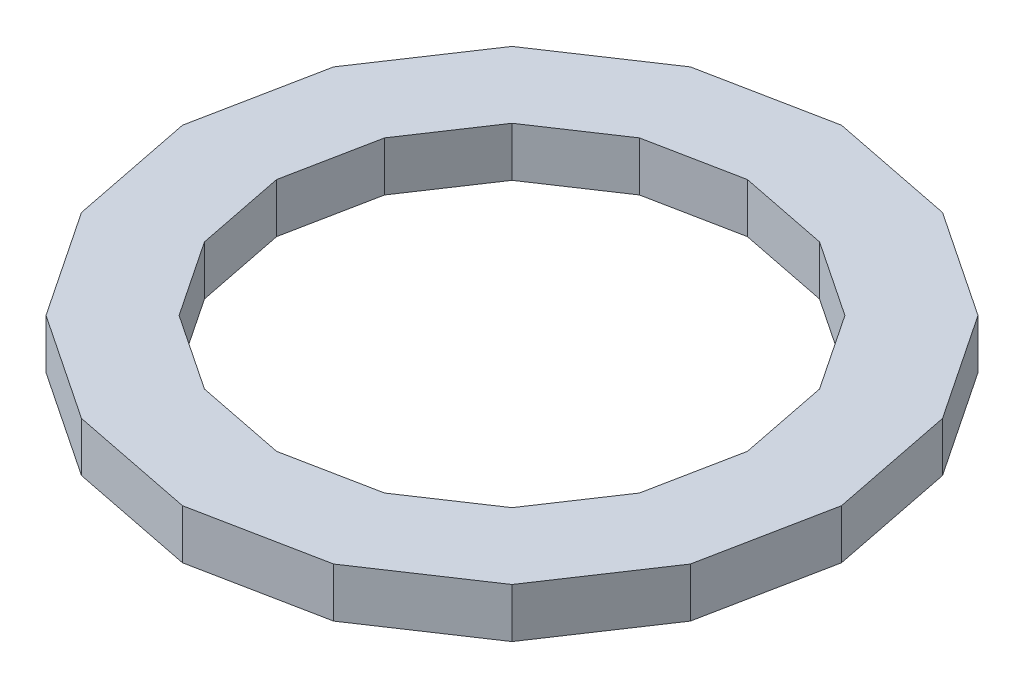
ISO-10303-21;
HEADER;
FILE_DESCRIPTION(('STEP AP214'),'2;1');
FILE_NAME('part.step','',(''),(''),'','','');
FILE_SCHEMA(('AUTOMOTIVE_DESIGN { 1 0 10303 214 1 1 1 1 }'));
ENDSEC;
DATA;
#1=APPLICATION_CONTEXT('core data for automotive mechanical design processes');
#2=APPLICATION_PROTOCOL_DEFINITION('international standard','automotive_design',2000,#1);
#3=PRODUCT_CONTEXT('',#1,'mechanical');
#4=PRODUCT('Part','Part','',(#3));
#5=PRODUCT_RELATED_PRODUCT_CATEGORY('part','',(#4));
#6=PRODUCT_DEFINITION_FORMATION('','',#4);
#7=PRODUCT_DEFINITION_CONTEXT('part definition',#1,'design');
#8=PRODUCT_DEFINITION('design','',#6,#7);
#9=PRODUCT_DEFINITION_SHAPE('','',#8);
#10=(LENGTH_UNIT() NAMED_UNIT(*) SI_UNIT(.MILLI.,.METRE.));
#11=(NAMED_UNIT(*) PLANE_ANGLE_UNIT() SI_UNIT($,.RADIAN.));
#12=(NAMED_UNIT(*) SI_UNIT($,.STERADIAN.) SOLID_ANGLE_UNIT());
#13=UNCERTAINTY_MEASURE_WITH_UNIT(LENGTH_MEASURE(1.E-05),#10,'distance_accuracy_value','');
#14=(GEOMETRIC_REPRESENTATION_CONTEXT(3) GLOBAL_UNCERTAINTY_ASSIGNED_CONTEXT((#13)) GLOBAL_UNIT_ASSIGNED_CONTEXT((#10,
#11,#12)) REPRESENTATION_CONTEXT('',''));
#15=CARTESIAN_POINT('',(0.,0.,0.));
#16=DIRECTION('',(0.,0.,1.));
#17=DIRECTION('',(1.,0.,0.));
#18=AXIS2_PLACEMENT_3D('',#15,#16,#17);
#19=CARTESIAN_POINT('',(0.,19.05,0.));
#20=DIRECTION('',(0.,1.,0.));
#21=DIRECTION('',(0.,0.,1.));
#22=AXIS2_PLACEMENT_3D('',#19,#20,#21);
#23=PLANE('',#22);
#24=DIRECTION('',(0.195090322016117,0.,-0.980785280403233));
#25=VECTOR('',#24,1.);
#26=CARTESIAN_POINT('',(117.278378477179,19.05,48.5782949383707));
#27=LINE('',#26,#25);
#28=CARTESIAN_POINT('',(117.278378477179,19.05,48.5782949383707));
#29=VERTEX_POINT('',#28);
#30=CARTESIAN_POINT('',(126.941202126637,19.05,-1.53002353760145E-12));
#31=VERTEX_POINT('',#30);
#32=EDGE_CURVE('E371',#29,#31,#27,.T.);
#33=ORIENTED_EDGE('',*,*,#32,.T.);
#34=DIRECTION('',(-0.19509032201614,0.,-0.980785280403228));
#35=VECTOR('',#34,1.);
#36=CARTESIAN_POINT('',(126.941202126637,19.05,-1.53002353760145E-12));
#37=LINE('',#36,#35);
#38=CARTESIAN_POINT('',(117.278378477178,19.05,-48.5782949383734));
#39=VERTEX_POINT('',#38);
#40=EDGE_CURVE('E374',#31,#39,#37,.T.);
#41=ORIENTED_EDGE('',*,*,#40,.T.);
#42=DIRECTION('',(-0.555570233019612,0.,-0.831469612302539));
#43=VECTOR('',#42,1.);
#44=CARTESIAN_POINT('',(117.278378477178,19.05,-48.5782949383734));
#45=LINE('',#44,#43);
#46=CARTESIAN_POINT('',(89.7609848357161,19.05,-89.7609848357183));
#47=VERTEX_POINT('',#46);
#48=EDGE_CURVE('E377',#39,#47,#45,.T.);
#49=ORIENTED_EDGE('',*,*,#48,.T.);
#50=DIRECTION('',(-0.831469612302552,0.,-0.555570233019592));
#51=VECTOR('',#50,1.);
#52=CARTESIAN_POINT('',(89.7609848357161,19.05,-89.7609848357183));
#53=LINE('',#52,#51);
#54=CARTESIAN_POINT('',(48.5782949383707,19.05,-117.278378477179));
#55=VERTEX_POINT('',#54);
#56=EDGE_CURVE('E379',#47,#55,#53,.T.);
#57=ORIENTED_EDGE('',*,*,#56,.T.);
#58=DIRECTION('',(-0.980785280403233,0.,-0.195090322016116));
#59=VECTOR('',#58,1.);
#60=CARTESIAN_POINT('',(48.5782949383707,19.05,-117.278378477179));
#61=LINE('',#60,#59);
#62=CARTESIAN_POINT('',(-1.53262944923296E-12,19.05,-126.941202126637));
#63=VERTEX_POINT('',#62);
#64=EDGE_CURVE('E381',#55,#63,#61,.T.);
#65=ORIENTED_EDGE('',*,*,#64,.T.);
#66=DIRECTION('',(-0.980785280403228,0.,0.19509032201614));
#67=VECTOR('',#66,1.);
#68=CARTESIAN_POINT('',(-1.53262944923296E-12,19.05,-126.941202126637));
#69=LINE('',#68,#67);
#70=CARTESIAN_POINT('',(-48.5782949383734,19.05,-117.278378477178));
#71=VERTEX_POINT('',#70);
#72=EDGE_CURVE('E383',#63,#71,#69,.T.);
#73=ORIENTED_EDGE('',*,*,#72,.T.);
#74=DIRECTION('',(-0.831469612302539,0.,0.555570233019612));
#75=VECTOR('',#74,1.);
#76=CARTESIAN_POINT('',(-48.5782949383734,19.05,-117.278378477178));
#77=LINE('',#76,#75);
#78=CARTESIAN_POINT('',(-89.7609848357183,19.05,-89.7609848357161));
#79=VERTEX_POINT('',#78);
#80=EDGE_CURVE('E385',#71,#79,#77,.T.);
#81=ORIENTED_EDGE('',*,*,#80,.T.);
#82=DIRECTION('',(-0.555570233019592,0.,0.831469612302552));
#83=VECTOR('',#82,1.);
#84=CARTESIAN_POINT('',(-89.7609848357183,19.05,-89.7609848357161));
#85=LINE('',#84,#83);
#86=CARTESIAN_POINT('',(-117.278378477179,19.05,-48.5782949383707));
#87=VERTEX_POINT('',#86);
#88=EDGE_CURVE('E387',#79,#87,#85,.T.);
#89=ORIENTED_EDGE('',*,*,#88,.T.);
#90=DIRECTION('',(-0.195090322016117,0.,0.980785280403233));
#91=VECTOR('',#90,1.);
#92=CARTESIAN_POINT('',(-117.278378477179,19.05,-48.5782949383707));
#93=LINE('',#92,#91);
#94=CARTESIAN_POINT('',(-126.941202126637,19.05,1.5616333386167E-12));
#95=VERTEX_POINT('',#94);
#96=EDGE_CURVE('E390',#87,#95,#93,.T.);
#97=ORIENTED_EDGE('',*,*,#96,.T.);
#98=DIRECTION('',(0.19509032201614,0.,0.980785280403228));
#99=VECTOR('',#98,1.);
#100=CARTESIAN_POINT('',(-126.941202126637,19.05,1.5616333386167E-12));
#101=LINE('',#100,#99);
#102=CARTESIAN_POINT('',(-117.278378477178,19.05,48.5782949383734));
#103=VERTEX_POINT('',#102);
#104=EDGE_CURVE('E392',#95,#103,#101,.T.);
#105=ORIENTED_EDGE('',*,*,#104,.T.);
#106=DIRECTION('',(0.555570233019612,0.,0.831469612302539));
#107=VECTOR('',#106,1.);
#108=CARTESIAN_POINT('',(-117.278378477178,19.05,48.5782949383734));
#109=LINE('',#108,#107);
#110=CARTESIAN_POINT('',(-89.7609848357162,19.05,89.7609848357182));
#111=VERTEX_POINT('',#110);
#112=EDGE_CURVE('E394',#103,#111,#109,.T.);
#113=ORIENTED_EDGE('',*,*,#112,.T.);
#114=DIRECTION('',(0.831469612302552,0.,0.555570233019592));
#115=VECTOR('',#114,1.);
#116=CARTESIAN_POINT('',(-89.7609848357162,19.05,89.7609848357182));
#117=LINE('',#116,#115);
#118=CARTESIAN_POINT('',(-48.5782949383706,19.05,117.278378477179));
#119=VERTEX_POINT('',#118);
#120=EDGE_CURVE('E397',#111,#119,#117,.T.);
#121=ORIENTED_EDGE('',*,*,#120,.T.);
#122=DIRECTION('',(0.980785280403233,0.,0.195090322016117));
#123=VECTOR('',#122,1.);
#124=CARTESIAN_POINT('',(-48.5782949383706,19.05,117.278378477179));
#125=LINE('',#124,#123);
#126=CARTESIAN_POINT('',(1.54465007218628E-12,19.05,126.941202126637));
#127=VERTEX_POINT('',#126);
#128=EDGE_CURVE('E400',#119,#127,#125,.T.);
#129=ORIENTED_EDGE('',*,*,#128,.T.);
#130=DIRECTION('',(0.980785280403228,0.,-0.195090322016139));
#131=VECTOR('',#130,1.);
#132=CARTESIAN_POINT('',(1.54465007218628E-12,19.05,126.941202126637));
#133=LINE('',#132,#131);
#134=CARTESIAN_POINT('',(48.5782949383735,19.05,117.278378477178));
#135=VERTEX_POINT('',#134);
#136=EDGE_CURVE('E402',#127,#135,#133,.T.);
#137=ORIENTED_EDGE('',*,*,#136,.T.);
#138=DIRECTION('',(0.831469612302538,0.,-0.555570233019612));
#139=VECTOR('',#138,1.);
#140=CARTESIAN_POINT('',(48.5782949383735,19.05,117.278378477178));
#141=LINE('',#140,#139);
#142=CARTESIAN_POINT('',(89.7609848357183,19.05,89.7609848357162));
#143=VERTEX_POINT('',#142);
#144=EDGE_CURVE('E405',#135,#143,#141,.T.);
#145=ORIENTED_EDGE('',*,*,#144,.T.);
#146=DIRECTION('',(0.555570233019592,0.,-0.831469612302552));
#147=VECTOR('',#146,1.);
#148=CARTESIAN_POINT('',(89.7609848357183,19.05,89.7609848357162));
#149=LINE('',#148,#147);
#150=EDGE_CURVE('E408',#143,#29,#149,.T.);
#151=ORIENTED_EDGE('',*,*,#150,.T.);
#152=EDGE_LOOP('',(#33,#41,#49,#57,#65,#73,#81,#89,#97,#105,#113,#121,#129,#137,#145,#151));
#153=FACE_BOUND('',#152,.T.);
#154=DIRECTION('',(-0.19509032201614,0.,-0.980785280403228));
#155=VECTOR('',#154,1.);
#156=CARTESIAN_POINT('',(90.6845405407492,19.05,-1.12429729305885E-12));
#157=LINE('',#156,#155);
#158=CARTESIAN_POINT('',(90.6845405407492,19.05,-1.12429729305885E-12));
#159=VERTEX_POINT('',#158);
#160=CARTESIAN_POINT('',(83.7815909207878,19.05,-34.703471236586));
#161=VERTEX_POINT('',#160);
#162=EDGE_CURVE('E253',#159,#161,#157,.T.);
#163=ORIENTED_EDGE('',*,*,#162,.F.);
#164=DIRECTION('',(0.195090322016117,0.,-0.980785280403233));
#165=VECTOR('',#164,1.);
#166=CARTESIAN_POINT('',(83.7815909207886,19.05,34.703471236584));
#167=LINE('',#166,#165);
#168=CARTESIAN_POINT('',(83.7815909207886,19.05,34.703471236584));
#169=VERTEX_POINT('',#168);
#170=EDGE_CURVE('E244',#169,#159,#167,.T.);
#171=ORIENTED_EDGE('',*,*,#170,.F.);
#172=DIRECTION('',(0.555570233019592,0.,-0.831469612302552));
#173=VECTOR('',#172,1.);
#174=CARTESIAN_POINT('',(64.1236535651509,19.05,64.1236535651494));
#175=LINE('',#174,#173);
#176=CARTESIAN_POINT('',(64.1236535651509,19.05,64.1236535651494));
#177=VERTEX_POINT('',#176);
#178=EDGE_CURVE('E296',#177,#169,#175,.T.);
#179=ORIENTED_EDGE('',*,*,#178,.F.);
#180=DIRECTION('',(0.831469612302539,0.,-0.555570233019612));
#181=VECTOR('',#180,1.);
#182=CARTESIAN_POINT('',(34.703471236586,19.05,83.7815909207878));
#183=LINE('',#182,#181);
#184=CARTESIAN_POINT('',(34.703471236586,19.05,83.7815909207878));
#185=VERTEX_POINT('',#184);
#186=EDGE_CURVE('E294',#185,#177,#183,.T.);
#187=ORIENTED_EDGE('',*,*,#186,.F.);
#188=DIRECTION('',(0.980785280403228,0.,-0.19509032201614));
#189=VECTOR('',#188,1.);
#190=CARTESIAN_POINT('',(1.02073300215481E-12,19.05,90.6845405407492));
#191=LINE('',#190,#189);
#192=CARTESIAN_POINT('',(1.02073300215481E-12,19.05,90.6845405407492));
#193=VERTEX_POINT('',#192);
#194=EDGE_CURVE('E292',#193,#185,#191,.T.);
#195=ORIENTED_EDGE('',*,*,#194,.F.);
#196=DIRECTION('',(0.980785280403233,0.,0.195090322016117));
#197=VECTOR('',#196,1.);
#198=CARTESIAN_POINT('',(-34.703471236584,19.05,83.7815909207887));
#199=LINE('',#198,#197);
#200=CARTESIAN_POINT('',(-34.703471236584,19.05,83.7815909207887));
#201=VERTEX_POINT('',#200);
#202=EDGE_CURVE('E290',#201,#193,#199,.T.);
#203=ORIENTED_EDGE('',*,*,#202,.F.);
#204=DIRECTION('',(0.831469612302552,0.,0.555570233019592));
#205=VECTOR('',#204,1.);
#206=CARTESIAN_POINT('',(-64.1236535651494,19.05,64.1236535651509));
#207=LINE('',#206,#205);
#208=CARTESIAN_POINT('',(-64.1236535651494,19.05,64.1236535651509));
#209=VERTEX_POINT('',#208);
#210=EDGE_CURVE('E288',#209,#201,#207,.T.);
#211=ORIENTED_EDGE('',*,*,#210,.F.);
#212=DIRECTION('',(0.555570233019612,0.,0.831469612302538));
#213=VECTOR('',#212,1.);
#214=CARTESIAN_POINT('',(-83.7815909207878,19.05,34.7034712365861));
#215=LINE('',#214,#213);
#216=CARTESIAN_POINT('',(-83.7815909207878,19.05,34.7034712365861));
#217=VERTEX_POINT('',#216);
#218=EDGE_CURVE('E286',#217,#209,#215,.T.);
#219=ORIENTED_EDGE('',*,*,#218,.F.);
#220=DIRECTION('',(0.19509032201614,0.,0.980785280403228));
#221=VECTOR('',#220,1.);
#222=CARTESIAN_POINT('',(-90.6845405407492,19.05,1.1506938046124E-12));
#223=LINE('',#222,#221);
#224=CARTESIAN_POINT('',(-90.6845405407492,19.05,1.1506938046124E-12));
#225=VERTEX_POINT('',#224);
#226=EDGE_CURVE('E284',#225,#217,#223,.T.);
#227=ORIENTED_EDGE('',*,*,#226,.F.);
#228=DIRECTION('',(-0.195090322016116,0.,0.980785280403233));
#229=VECTOR('',#228,1.);
#230=CARTESIAN_POINT('',(-83.7815909207886,19.05,-34.703471236584));
#231=LINE('',#230,#229);
#232=CARTESIAN_POINT('',(-83.7815909207886,19.05,-34.703471236584));
#233=VERTEX_POINT('',#232);
#234=EDGE_CURVE('E281',#233,#225,#231,.T.);
#235=ORIENTED_EDGE('',*,*,#234,.F.);
#236=DIRECTION('',(-0.555570233019592,0.,0.831469612302552));
#237=VECTOR('',#236,1.);
#238=CARTESIAN_POINT('',(-64.1236535651509,19.05,-64.1236535651493));
#239=LINE('',#238,#237);
#240=CARTESIAN_POINT('',(-64.1236535651509,19.05,-64.1236535651493));
#241=VERTEX_POINT('',#240);
#242=EDGE_CURVE('E278',#241,#233,#239,.T.);
#243=ORIENTED_EDGE('',*,*,#242,.F.);
#244=DIRECTION('',(-0.831469612302538,0.,0.555570233019612));
#245=VECTOR('',#244,1.);
#246=CARTESIAN_POINT('',(-34.7034712365861,19.05,-83.7815909207877));
#247=LINE('',#246,#245);
#248=CARTESIAN_POINT('',(-34.7034712365861,19.05,-83.7815909207877));
#249=VERTEX_POINT('',#248);
#250=EDGE_CURVE('E276',#249,#241,#247,.T.);
#251=ORIENTED_EDGE('',*,*,#250,.F.);
#252=DIRECTION('',(-0.980785280403228,0.,0.19509032201614));
#253=VECTOR('',#252,1.);
#254=CARTESIAN_POINT('',(-1.13817047648465E-12,19.05,-90.6845405407492));
#255=LINE('',#254,#253);
#256=CARTESIAN_POINT('',(-1.13817047648465E-12,19.05,-90.6845405407492));
#257=VERTEX_POINT('',#256);
#258=EDGE_CURVE('E274',#257,#249,#255,.T.);
#259=ORIENTED_EDGE('',*,*,#258,.F.);
#260=DIRECTION('',(-0.980785280403233,0.,-0.195090322016117));
#261=VECTOR('',#260,1.);
#262=CARTESIAN_POINT('',(34.7034712365841,19.05,-83.7815909207885));
#263=LINE('',#262,#261);
#264=CARTESIAN_POINT('',(34.7034712365841,19.05,-83.7815909207885));
#265=VERTEX_POINT('',#264);
#266=EDGE_CURVE('E272',#265,#257,#263,.T.);
#267=ORIENTED_EDGE('',*,*,#266,.F.);
#268=DIRECTION('',(-0.831469612302552,0.,-0.555570233019592));
#269=VECTOR('',#268,1.);
#270=CARTESIAN_POINT('',(64.1236535651494,19.05,-64.1236535651509));
#271=LINE('',#270,#269);
#272=CARTESIAN_POINT('',(64.1236535651494,19.05,-64.1236535651509));
#273=VERTEX_POINT('',#272);
#274=EDGE_CURVE('E268',#273,#265,#271,.T.);
#275=ORIENTED_EDGE('',*,*,#274,.F.);
#276=DIRECTION('',(-0.555570233019612,0.,-0.831469612302538));
#277=VECTOR('',#276,1.);
#278=CARTESIAN_POINT('',(83.7815909207878,19.05,-34.703471236586));
#279=LINE('',#278,#277);
#280=EDGE_CURVE('E266',#161,#273,#279,.T.);
#281=ORIENTED_EDGE('',*,*,#280,.F.);
#282=EDGE_LOOP('',(#163,#171,#179,#187,#195,#203,#211,#219,#227,#235,#243,#251,#259,#267,#275,#281));
#283=FACE_BOUND('',#282,.T.);
#284=ADVANCED_FACE('F35',(#153,#283),#23,.T.);
#285=CARTESIAN_POINT('',(0.,0.,0.));
#286=DIRECTION('',(0.,1.,0.));
#287=DIRECTION('',(0.,0.,1.));
#288=AXIS2_PLACEMENT_3D('',#285,#286,#287);
#289=PLANE('',#288);
#290=DIRECTION('',(0.195090322016117,0.,-0.980785280403233));
#291=VECTOR('',#290,1.);
#292=CARTESIAN_POINT('',(117.278378477179,0.,48.5782949383707));
#293=LINE('',#292,#291);
#294=CARTESIAN_POINT('',(117.278378477179,0.,48.5782949383707));
#295=VERTEX_POINT('',#294);
#296=CARTESIAN_POINT('',(126.941202126637,0.,-1.53002353760145E-12));
#297=VERTEX_POINT('',#296);
#298=EDGE_CURVE('E261',#295,#297,#293,.T.);
#299=ORIENTED_EDGE('',*,*,#298,.F.);
#300=DIRECTION('',(0.555570233019592,0.,-0.831469612302552));
#301=VECTOR('',#300,1.);
#302=CARTESIAN_POINT('',(89.7609848357183,0.,89.7609848357162));
#303=LINE('',#302,#301);
#304=CARTESIAN_POINT('',(89.7609848357183,0.,89.7609848357162));
#305=VERTEX_POINT('',#304);
#306=EDGE_CURVE('E375',#305,#295,#303,.T.);
#307=ORIENTED_EDGE('',*,*,#306,.F.);
#308=DIRECTION('',(0.831469612302538,0.,-0.555570233019612));
#309=VECTOR('',#308,1.);
#310=CARTESIAN_POINT('',(48.5782949383735,0.,117.278378477178));
#311=LINE('',#310,#309);
#312=CARTESIAN_POINT('',(48.5782949383735,0.,117.278378477178));
#313=VERTEX_POINT('',#312);
#314=EDGE_CURVE('E445',#313,#305,#311,.T.);
#315=ORIENTED_EDGE('',*,*,#314,.F.);
#316=DIRECTION('',(0.980785280403228,0.,-0.195090322016139));
#317=VECTOR('',#316,1.);
#318=CARTESIAN_POINT('',(1.54465007218628E-12,0.,126.941202126637));
#319=LINE('',#318,#317);
#320=CARTESIAN_POINT('',(1.54465007218628E-12,0.,126.941202126637));
#321=VERTEX_POINT('',#320);
#322=EDGE_CURVE('E442',#321,#313,#319,.T.);
#323=ORIENTED_EDGE('',*,*,#322,.F.);
#324=DIRECTION('',(0.980785280403233,0.,0.195090322016117));
#325=VECTOR('',#324,1.);
#326=CARTESIAN_POINT('',(-48.5782949383706,0.,117.278378477179));
#327=LINE('',#326,#325);
#328=CARTESIAN_POINT('',(-48.5782949383706,0.,117.278378477179));
#329=VERTEX_POINT('',#328);
#330=EDGE_CURVE('E439',#329,#321,#327,.T.);
#331=ORIENTED_EDGE('',*,*,#330,.F.);
#332=DIRECTION('',(0.831469612302552,0.,0.555570233019592));
#333=VECTOR('',#332,1.);
#334=CARTESIAN_POINT('',(-89.7609848357162,0.,89.7609848357182));
#335=LINE('',#334,#333);
#336=CARTESIAN_POINT('',(-89.7609848357162,0.,89.7609848357182));
#337=VERTEX_POINT('',#336);
#338=EDGE_CURVE('E436',#337,#329,#335,.T.);
#339=ORIENTED_EDGE('',*,*,#338,.F.);
#340=DIRECTION('',(0.555570233019612,0.,0.831469612302539));
#341=VECTOR('',#340,1.);
#342=CARTESIAN_POINT('',(-117.278378477178,0.,48.5782949383734));
#343=LINE('',#342,#341);
#344=CARTESIAN_POINT('',(-117.278378477178,0.,48.5782949383734));
#345=VERTEX_POINT('',#344);
#346=EDGE_CURVE('E433',#345,#337,#343,.T.);
#347=ORIENTED_EDGE('',*,*,#346,.F.);
#348=DIRECTION('',(0.19509032201614,0.,0.980785280403228));
#349=VECTOR('',#348,1.);
#350=CARTESIAN_POINT('',(-126.941202126637,0.,1.5616333386167E-12));
#351=LINE('',#350,#349);
#352=CARTESIAN_POINT('',(-126.941202126637,0.,1.5616333386167E-12));
#353=VERTEX_POINT('',#352);
#354=EDGE_CURVE('E430',#353,#345,#351,.T.);
#355=ORIENTED_EDGE('',*,*,#354,.F.);
#356=DIRECTION('',(-0.195090322016117,0.,0.980785280403233));
#357=VECTOR('',#356,1.);
#358=CARTESIAN_POINT('',(-117.278378477179,0.,-48.5782949383707));
#359=LINE('',#358,#357);
#360=CARTESIAN_POINT('',(-117.278378477179,0.,-48.5782949383707));
#361=VERTEX_POINT('',#360);
#362=EDGE_CURVE('E428',#361,#353,#359,.T.);
#363=ORIENTED_EDGE('',*,*,#362,.F.);
#364=DIRECTION('',(-0.555570233019592,0.,0.831469612302552));
#365=VECTOR('',#364,1.);
#366=CARTESIAN_POINT('',(-89.7609848357183,0.,-89.7609848357161));
#367=LINE('',#366,#365);
#368=CARTESIAN_POINT('',(-89.7609848357183,0.,-89.7609848357161));
#369=VERTEX_POINT('',#368);
#370=EDGE_CURVE('E426',#369,#361,#367,.T.);
#371=ORIENTED_EDGE('',*,*,#370,.F.);
#372=DIRECTION('',(-0.831469612302539,0.,0.555570233019612));
#373=VECTOR('',#372,1.);
#374=CARTESIAN_POINT('',(-48.5782949383734,0.,-117.278378477178));
#375=LINE('',#374,#373);
#376=CARTESIAN_POINT('',(-48.5782949383734,0.,-117.278378477178));
#377=VERTEX_POINT('',#376);
#378=EDGE_CURVE('E424',#377,#369,#375,.T.);
#379=ORIENTED_EDGE('',*,*,#378,.F.);
#380=DIRECTION('',(-0.980785280403228,0.,0.19509032201614));
#381=VECTOR('',#380,1.);
#382=CARTESIAN_POINT('',(-1.53262944923296E-12,0.,-126.941202126637));
#383=LINE('',#382,#381);
#384=CARTESIAN_POINT('',(-1.53262944923296E-12,0.,-126.941202126637));
#385=VERTEX_POINT('',#384);
#386=EDGE_CURVE('E422',#385,#377,#383,.T.);
#387=ORIENTED_EDGE('',*,*,#386,.F.);
#388=DIRECTION('',(-0.980785280403233,0.,-0.195090322016116));
#389=VECTOR('',#388,1.);
#390=CARTESIAN_POINT('',(48.5782949383707,0.,-117.278378477179));
#391=LINE('',#390,#389);
#392=CARTESIAN_POINT('',(48.5782949383707,0.,-117.278378477179));
#393=VERTEX_POINT('',#392);
#394=EDGE_CURVE('E420',#393,#385,#391,.T.);
#395=ORIENTED_EDGE('',*,*,#394,.F.);
#396=DIRECTION('',(-0.831469612302552,0.,-0.555570233019592));
#397=VECTOR('',#396,1.);
#398=CARTESIAN_POINT('',(89.7609848357161,0.,-89.7609848357183));
#399=LINE('',#398,#397);
#400=CARTESIAN_POINT('',(89.7609848357161,0.,-89.7609848357183));
#401=VERTEX_POINT('',#400);
#402=EDGE_CURVE('E418',#401,#393,#399,.T.);
#403=ORIENTED_EDGE('',*,*,#402,.F.);
#404=DIRECTION('',(-0.555570233019612,0.,-0.831469612302539));
#405=VECTOR('',#404,1.);
#406=CARTESIAN_POINT('',(117.278378477178,0.,-48.5782949383734));
#407=LINE('',#406,#405);
#408=CARTESIAN_POINT('',(117.278378477178,0.,-48.5782949383734));
#409=VERTEX_POINT('',#408);
#410=EDGE_CURVE('E416',#409,#401,#407,.T.);
#411=ORIENTED_EDGE('',*,*,#410,.F.);
#412=DIRECTION('',(-0.19509032201614,0.,-0.980785280403228));
#413=VECTOR('',#412,1.);
#414=CARTESIAN_POINT('',(126.941202126637,0.,-1.53002353760145E-12));
#415=LINE('',#414,#413);
#416=EDGE_CURVE('E414',#297,#409,#415,.T.);
#417=ORIENTED_EDGE('',*,*,#416,.F.);
#418=EDGE_LOOP('',(#299,#307,#315,#323,#331,#339,#347,#355,#363,#371,#379,#387,#395,#403,#411,#417));
#419=FACE_BOUND('',#418,.T.);
#420=DIRECTION('',(0.195090322016117,0.,-0.980785280403233));
#421=VECTOR('',#420,1.);
#422=CARTESIAN_POINT('',(83.7815909207886,0.,34.703471236584));
#423=LINE('',#422,#421);
#424=CARTESIAN_POINT('',(83.7815909207887,0.,34.703471236584));
#425=VERTEX_POINT('',#424);
#426=CARTESIAN_POINT('',(90.6845405407492,0.,-1.12429729305885E-12));
#427=VERTEX_POINT('',#426);
#428=EDGE_CURVE('E58',#425,#427,#423,.T.);
#429=ORIENTED_EDGE('',*,*,#428,.T.);
#430=DIRECTION('',(-0.19509032201614,0.,-0.980785280403228));
#431=VECTOR('',#430,1.);
#432=CARTESIAN_POINT('',(90.6845405407492,0.,-1.12429729305885E-12));
#433=LINE('',#432,#431);
#434=CARTESIAN_POINT('',(83.7815909207878,0.,-34.703471236586));
#435=VERTEX_POINT('',#434);
#436=EDGE_CURVE('E260',#427,#435,#433,.T.);
#437=ORIENTED_EDGE('',*,*,#436,.T.);
#438=DIRECTION('',(-0.555570233019612,0.,-0.831469612302538));
#439=VECTOR('',#438,1.);
#440=CARTESIAN_POINT('',(83.7815909207878,0.,-34.703471236586));
#441=LINE('',#440,#439);
#442=CARTESIAN_POINT('',(64.1236535651494,0.,-64.1236535651509));
#443=VERTEX_POINT('',#442);
#444=EDGE_CURVE('E300',#435,#443,#441,.T.);
#445=ORIENTED_EDGE('',*,*,#444,.T.);
#446=DIRECTION('',(-0.831469612302552,0.,-0.555570233019592));
#447=VECTOR('',#446,1.);
#448=CARTESIAN_POINT('',(64.1236535651494,0.,-64.1236535651509));
#449=LINE('',#448,#447);
#450=CARTESIAN_POINT('',(34.7034712365841,0.,-83.7815909207885));
#451=VERTEX_POINT('',#450);
#452=EDGE_CURVE('E303',#443,#451,#449,.T.);
#453=ORIENTED_EDGE('',*,*,#452,.T.);
#454=DIRECTION('',(-0.980785280403233,0.,-0.195090322016117));
#455=VECTOR('',#454,1.);
#456=CARTESIAN_POINT('',(34.7034712365841,0.,-83.7815909207885));
#457=LINE('',#456,#455);
#458=CARTESIAN_POINT('',(-1.13817047648465E-12,0.,-90.6845405407492));
#459=VERTEX_POINT('',#458);
#460=EDGE_CURVE('E306',#451,#459,#457,.T.);
#461=ORIENTED_EDGE('',*,*,#460,.T.);
#462=DIRECTION('',(-0.980785280403228,0.,0.19509032201614));
#463=VECTOR('',#462,1.);
#464=CARTESIAN_POINT('',(-1.13817047648465E-12,0.,-90.6845405407492));
#465=LINE('',#464,#463);
#466=CARTESIAN_POINT('',(-34.7034712365861,0.,-83.7815909207877));
#467=VERTEX_POINT('',#466);
#468=EDGE_CURVE('E309',#459,#467,#465,.T.);
#469=ORIENTED_EDGE('',*,*,#468,.T.);
#470=DIRECTION('',(-0.831469612302538,0.,0.555570233019612));
#471=VECTOR('',#470,1.);
#472=CARTESIAN_POINT('',(-34.7034712365861,0.,-83.7815909207877));
#473=LINE('',#472,#471);
#474=CARTESIAN_POINT('',(-64.1236535651509,0.,-64.1236535651493));
#475=VERTEX_POINT('',#474);
#476=EDGE_CURVE('E312',#467,#475,#473,.T.);
#477=ORIENTED_EDGE('',*,*,#476,.T.);
#478=DIRECTION('',(-0.555570233019592,0.,0.831469612302552));
#479=VECTOR('',#478,1.);
#480=CARTESIAN_POINT('',(-64.1236535651509,0.,-64.1236535651493));
#481=LINE('',#480,#479);
#482=CARTESIAN_POINT('',(-83.7815909207886,0.,-34.703471236584));
#483=VERTEX_POINT('',#482);
#484=EDGE_CURVE('E315',#475,#483,#481,.T.);
#485=ORIENTED_EDGE('',*,*,#484,.T.);
#486=DIRECTION('',(-0.195090322016116,0.,0.980785280403233));
#487=VECTOR('',#486,1.);
#488=CARTESIAN_POINT('',(-83.7815909207886,0.,-34.703471236584));
#489=LINE('',#488,#487);
#490=CARTESIAN_POINT('',(-90.6845405407492,0.,1.1506938046124E-12));
#491=VERTEX_POINT('',#490);
#492=EDGE_CURVE('E318',#483,#491,#489,.T.);
#493=ORIENTED_EDGE('',*,*,#492,.T.);
#494=DIRECTION('',(0.19509032201614,0.,0.980785280403228));
#495=VECTOR('',#494,1.);
#496=CARTESIAN_POINT('',(-90.6845405407492,0.,1.1506938046124E-12));
#497=LINE('',#496,#495);
#498=CARTESIAN_POINT('',(-83.7815909207878,0.,34.7034712365861));
#499=VERTEX_POINT('',#498);
#500=EDGE_CURVE('E322',#491,#499,#497,.T.);
#501=ORIENTED_EDGE('',*,*,#500,.T.);
#502=DIRECTION('',(0.555570233019612,0.,0.831469612302538));
#503=VECTOR('',#502,1.);
#504=CARTESIAN_POINT('',(-83.7815909207878,0.,34.7034712365861));
#505=LINE('',#504,#503);
#506=CARTESIAN_POINT('',(-64.1236535651494,0.,64.1236535651509));
#507=VERTEX_POINT('',#506);
#508=EDGE_CURVE('E325',#499,#507,#505,.T.);
#509=ORIENTED_EDGE('',*,*,#508,.T.);
#510=DIRECTION('',(0.831469612302552,0.,0.555570233019592));
#511=VECTOR('',#510,1.);
#512=CARTESIAN_POINT('',(-64.1236535651494,0.,64.1236535651509));
#513=LINE('',#512,#511);
#514=CARTESIAN_POINT('',(-34.703471236584,0.,83.7815909207887));
#515=VERTEX_POINT('',#514);
#516=EDGE_CURVE('E328',#507,#515,#513,.T.);
#517=ORIENTED_EDGE('',*,*,#516,.T.);
#518=DIRECTION('',(0.980785280403233,0.,0.195090322016117));
#519=VECTOR('',#518,1.);
#520=CARTESIAN_POINT('',(-34.703471236584,0.,83.7815909207887));
#521=LINE('',#520,#519);
#522=CARTESIAN_POINT('',(1.02073300215481E-12,0.,90.6845405407492));
#523=VERTEX_POINT('',#522);
#524=EDGE_CURVE('E331',#515,#523,#521,.T.);
#525=ORIENTED_EDGE('',*,*,#524,.T.);
#526=DIRECTION('',(0.980785280403228,0.,-0.19509032201614));
#527=VECTOR('',#526,1.);
#528=CARTESIAN_POINT('',(1.02073300215481E-12,0.,90.6845405407492));
#529=LINE('',#528,#527);
#530=CARTESIAN_POINT('',(34.703471236586,0.,83.7815909207878));
#531=VERTEX_POINT('',#530);
#532=EDGE_CURVE('E334',#523,#531,#529,.T.);
#533=ORIENTED_EDGE('',*,*,#532,.T.);
#534=DIRECTION('',(0.831469612302539,0.,-0.555570233019612));
#535=VECTOR('',#534,1.);
#536=CARTESIAN_POINT('',(34.703471236586,0.,83.7815909207878));
#537=LINE('',#536,#535);
#538=CARTESIAN_POINT('',(64.1236535651509,0.,64.1236535651494));
#539=VERTEX_POINT('',#538);
#540=EDGE_CURVE('E337',#531,#539,#537,.T.);
#541=ORIENTED_EDGE('',*,*,#540,.T.);
#542=DIRECTION('',(0.555570233019592,0.,-0.831469612302552));
#543=VECTOR('',#542,1.);
#544=CARTESIAN_POINT('',(64.1236535651509,0.,64.1236535651494));
#545=LINE('',#544,#543);
#546=EDGE_CURVE('E254',#539,#425,#545,.T.);
#547=ORIENTED_EDGE('',*,*,#546,.T.);
#548=EDGE_LOOP('',(#429,#437,#445,#453,#461,#469,#477,#485,#493,#501,#509,#517,#525,#533,#541,#547));
#549=FACE_BOUND('',#548,.T.);
#550=ADVANCED_FACE('F504',(#419,#549),#289,.F.);
#551=CARTESIAN_POINT('',(117.278378477179,19.05,48.5782949383707));
#552=DIRECTION('',(-0.980785280403233,0.,-0.195090322016117));
#553=DIRECTION('',(-0.195090322016117,0.,0.980785280403233));
#554=AXIS2_PLACEMENT_3D('',#551,#552,#553);
#555=PLANE('',#554);
#556=ORIENTED_EDGE('',*,*,#298,.T.);
#557=DIRECTION('',(0.,-1.,0.));
#558=VECTOR('',#557,1.);
#559=CARTESIAN_POINT('',(126.941202126637,19.05,-1.53002353760145E-12));
#560=LINE('',#559,#558);
#561=EDGE_CURVE('E11',#31,#297,#560,.T.);
#562=ORIENTED_EDGE('',*,*,#561,.F.);
#563=ORIENTED_EDGE('',*,*,#32,.F.);
#564=DIRECTION('',(0.,-1.,0.));
#565=VECTOR('',#564,1.);
#566=CARTESIAN_POINT('',(117.278378477179,19.05,48.5782949383707));
#567=LINE('',#566,#565);
#568=EDGE_CURVE('E410',#29,#295,#567,.T.);
#569=ORIENTED_EDGE('',*,*,#568,.T.);
#570=EDGE_LOOP('',(#556,#562,#563,#569));
#571=FACE_BOUND('',#570,.T.);
#572=ADVANCED_FACE('F37',(#571),#555,.F.);
#573=CARTESIAN_POINT('',(126.941202126637,19.05,-1.53002353760145E-12));
#574=DIRECTION('',(-0.980785280403228,0.,0.19509032201614));
#575=DIRECTION('',(0.19509032201614,0.,0.980785280403228));
#576=AXIS2_PLACEMENT_3D('',#573,#574,#575);
#577=PLANE('',#576);
#578=ORIENTED_EDGE('',*,*,#416,.T.);
#579=DIRECTION('',(0.,-1.,0.));
#580=VECTOR('',#579,1.);
#581=CARTESIAN_POINT('',(117.278378477178,19.05,-48.5782949383734));
#582=LINE('',#581,#580);
#583=EDGE_CURVE('E43',#39,#409,#582,.T.);
#584=ORIENTED_EDGE('',*,*,#583,.F.);
#585=ORIENTED_EDGE('',*,*,#40,.F.);
#586=ORIENTED_EDGE('',*,*,#561,.T.);
#587=EDGE_LOOP('',(#578,#584,#585,#586));
#588=FACE_BOUND('',#587,.T.);
#589=ADVANCED_FACE('F521',(#588),#577,.F.);
#590=CARTESIAN_POINT('',(117.278378477178,19.05,-48.5782949383734));
#591=DIRECTION('',(-0.831469612302539,0.,0.555570233019612));
#592=DIRECTION('',(0.555570233019612,0.,0.831469612302539));
#593=AXIS2_PLACEMENT_3D('',#590,#591,#592);
#594=PLANE('',#593);
#595=ORIENTED_EDGE('',*,*,#410,.T.);
#596=DIRECTION('',(0.,-1.,0.));
#597=VECTOR('',#596,1.);
#598=CARTESIAN_POINT('',(89.7609848357161,19.05,-89.7609848357183));
#599=LINE('',#598,#597);
#600=EDGE_CURVE('E491',#47,#401,#599,.T.);
#601=ORIENTED_EDGE('',*,*,#600,.F.);
#602=ORIENTED_EDGE('',*,*,#48,.F.);
#603=ORIENTED_EDGE('',*,*,#583,.T.);
#604=EDGE_LOOP('',(#595,#601,#602,#603));
#605=FACE_BOUND('',#604,.T.);
#606=ADVANCED_FACE('F498',(#605),#594,.F.);
#607=CARTESIAN_POINT('',(89.7609848357161,19.05,-89.7609848357183));
#608=DIRECTION('',(-0.555570233019592,0.,0.831469612302552));
#609=DIRECTION('',(0.831469612302552,0.,0.555570233019592));
#610=AXIS2_PLACEMENT_3D('',#607,#608,#609);
#611=PLANE('',#610);
#612=ORIENTED_EDGE('',*,*,#402,.T.);
#613=DIRECTION('',(0.,-1.,0.));
#614=VECTOR('',#613,1.);
#615=CARTESIAN_POINT('',(48.5782949383707,19.05,-117.278378477179));
#616=LINE('',#615,#614);
#617=EDGE_CURVE('E487',#55,#393,#616,.T.);
#618=ORIENTED_EDGE('',*,*,#617,.F.);
#619=ORIENTED_EDGE('',*,*,#56,.F.);
#620=ORIENTED_EDGE('',*,*,#600,.T.);
#621=EDGE_LOOP('',(#612,#618,#619,#620));
#622=FACE_BOUND('',#621,.T.);
#623=ADVANCED_FACE('F510',(#622),#611,.F.);
#624=CARTESIAN_POINT('',(48.5782949383707,19.05,-117.278378477179));
#625=DIRECTION('',(-0.195090322016117,0.,0.980785280403233));
#626=DIRECTION('',(0.980785280403233,0.,0.195090322016117));
#627=AXIS2_PLACEMENT_3D('',#624,#625,#626);
#628=PLANE('',#627);
#629=ORIENTED_EDGE('',*,*,#394,.T.);
#630=DIRECTION('',(0.,-1.,0.));
#631=VECTOR('',#630,1.);
#632=CARTESIAN_POINT('',(-1.53262944923296E-12,19.05,-126.941202126637));
#633=LINE('',#632,#631);
#634=EDGE_CURVE('E484',#63,#385,#633,.T.);
#635=ORIENTED_EDGE('',*,*,#634,.F.);
#636=ORIENTED_EDGE('',*,*,#64,.F.);
#637=ORIENTED_EDGE('',*,*,#617,.T.);
#638=EDGE_LOOP('',(#629,#635,#636,#637));
#639=FACE_BOUND('',#638,.T.);
#640=ADVANCED_FACE('F514',(#639),#628,.F.);
#641=CARTESIAN_POINT('',(-1.53262944923296E-12,19.05,-126.941202126637));
#642=DIRECTION('',(0.19509032201614,0.,0.980785280403228));
#643=DIRECTION('',(0.980785280403228,0.,-0.19509032201614));
#644=AXIS2_PLACEMENT_3D('',#641,#642,#643);
#645=PLANE('',#644);
#646=ORIENTED_EDGE('',*,*,#386,.T.);
#647=DIRECTION('',(0.,-1.,0.));
#648=VECTOR('',#647,1.);
#649=CARTESIAN_POINT('',(-48.5782949383734,19.05,-117.278378477178));
#650=LINE('',#649,#648);
#651=EDGE_CURVE('E480',#71,#377,#650,.T.);
#652=ORIENTED_EDGE('',*,*,#651,.F.);
#653=ORIENTED_EDGE('',*,*,#72,.F.);
#654=ORIENTED_EDGE('',*,*,#634,.T.);
#655=EDGE_LOOP('',(#646,#652,#653,#654));
#656=FACE_BOUND('',#655,.T.);
#657=ADVANCED_FACE('F574',(#656),#645,.F.);
#658=CARTESIAN_POINT('',(-48.5782949383734,19.05,-117.278378477178));
#659=DIRECTION('',(0.555570233019612,0.,0.831469612302539));
#660=DIRECTION('',(0.831469612302539,0.,-0.555570233019612));
#661=AXIS2_PLACEMENT_3D('',#658,#659,#660);
#662=PLANE('',#661);
#663=ORIENTED_EDGE('',*,*,#378,.T.);
#664=DIRECTION('',(0.,-1.,0.));
#665=VECTOR('',#664,1.);
#666=CARTESIAN_POINT('',(-89.7609848357183,19.05,-89.7609848357161));
#667=LINE('',#666,#665);
#668=EDGE_CURVE('E477',#79,#369,#667,.T.);
#669=ORIENTED_EDGE('',*,*,#668,.F.);
#670=ORIENTED_EDGE('',*,*,#80,.F.);
#671=ORIENTED_EDGE('',*,*,#651,.T.);
#672=EDGE_LOOP('',(#663,#669,#670,#671));
#673=FACE_BOUND('',#672,.T.);
#674=ADVANCED_FACE('F571',(#673),#662,.F.);
#675=CARTESIAN_POINT('',(-89.7609848357183,19.05,-89.7609848357161));
#676=DIRECTION('',(0.831469612302552,0.,0.555570233019592));
#677=DIRECTION('',(0.555570233019592,0.,-0.831469612302552));
#678=AXIS2_PLACEMENT_3D('',#675,#676,#677);
#679=PLANE('',#678);
#680=ORIENTED_EDGE('',*,*,#370,.T.);
#681=DIRECTION('',(0.,-1.,0.));
#682=VECTOR('',#681,1.);
#683=CARTESIAN_POINT('',(-117.278378477179,19.05,-48.5782949383707));
#684=LINE('',#683,#682);
#685=EDGE_CURVE('E474',#87,#361,#684,.T.);
#686=ORIENTED_EDGE('',*,*,#685,.F.);
#687=ORIENTED_EDGE('',*,*,#88,.F.);
#688=ORIENTED_EDGE('',*,*,#668,.T.);
#689=EDGE_LOOP('',(#680,#686,#687,#688));
#690=FACE_BOUND('',#689,.T.);
#691=ADVANCED_FACE('F567',(#690),#679,.F.);
#692=CARTESIAN_POINT('',(-117.278378477179,19.05,-48.5782949383707));
#693=DIRECTION('',(0.980785280403233,0.,0.195090322016117));
#694=DIRECTION('',(0.195090322016117,0.,-0.980785280403233));
#695=AXIS2_PLACEMENT_3D('',#692,#693,#694);
#696=PLANE('',#695);
#697=ORIENTED_EDGE('',*,*,#362,.T.);
#698=DIRECTION('',(0.,-1.,0.));
#699=VECTOR('',#698,1.);
#700=CARTESIAN_POINT('',(-126.941202126637,19.05,1.5616333386167E-12));
#701=LINE('',#700,#699);
#702=EDGE_CURVE('E471',#95,#353,#701,.T.);
#703=ORIENTED_EDGE('',*,*,#702,.F.);
#704=ORIENTED_EDGE('',*,*,#96,.F.);
#705=ORIENTED_EDGE('',*,*,#685,.T.);
#706=EDGE_LOOP('',(#697,#703,#704,#705));
#707=FACE_BOUND('',#706,.T.);
#708=ADVANCED_FACE('F563',(#707),#696,.F.);
#709=CARTESIAN_POINT('',(-126.941202126637,19.05,1.5616333386167E-12));
#710=DIRECTION('',(0.980785280403228,0.,-0.19509032201614));
#711=DIRECTION('',(-0.19509032201614,0.,-0.980785280403228));
#712=AXIS2_PLACEMENT_3D('',#709,#710,#711);
#713=PLANE('',#712);
#714=ORIENTED_EDGE('',*,*,#354,.T.);
#715=DIRECTION('',(0.,-1.,0.));
#716=VECTOR('',#715,1.);
#717=CARTESIAN_POINT('',(-117.278378477178,19.05,48.5782949383734));
#718=LINE('',#717,#716);
#719=EDGE_CURVE('E467',#103,#345,#718,.T.);
#720=ORIENTED_EDGE('',*,*,#719,.F.);
#721=ORIENTED_EDGE('',*,*,#104,.F.);
#722=ORIENTED_EDGE('',*,*,#702,.T.);
#723=EDGE_LOOP('',(#714,#720,#721,#722));
#724=FACE_BOUND('',#723,.T.);
#725=ADVANCED_FACE('F558',(#724),#713,.F.);
#726=CARTESIAN_POINT('',(-117.278378477178,19.05,48.5782949383734));
#727=DIRECTION('',(0.831469612302539,0.,-0.555570233019612));
#728=DIRECTION('',(-0.555570233019612,0.,-0.831469612302539));
#729=AXIS2_PLACEMENT_3D('',#726,#727,#728);
#730=PLANE('',#729);
#731=ORIENTED_EDGE('',*,*,#346,.T.);
#732=DIRECTION('',(0.,-1.,0.));
#733=VECTOR('',#732,1.);
#734=CARTESIAN_POINT('',(-89.7609848357162,19.05,89.7609848357182));
#735=LINE('',#734,#733);
#736=EDGE_CURVE('E464',#111,#337,#735,.T.);
#737=ORIENTED_EDGE('',*,*,#736,.F.);
#738=ORIENTED_EDGE('',*,*,#112,.F.);
#739=ORIENTED_EDGE('',*,*,#719,.T.);
#740=EDGE_LOOP('',(#731,#737,#738,#739));
#741=FACE_BOUND('',#740,.T.);
#742=ADVANCED_FACE('F552',(#741),#730,.F.);
#743=CARTESIAN_POINT('',(-89.7609848357162,19.05,89.7609848357182));
#744=DIRECTION('',(0.555570233019592,0.,-0.831469612302552));
#745=DIRECTION('',(-0.831469612302552,0.,-0.555570233019592));
#746=AXIS2_PLACEMENT_3D('',#743,#744,#745);
#747=PLANE('',#746);
#748=ORIENTED_EDGE('',*,*,#338,.T.);
#749=DIRECTION('',(0.,-1.,0.));
#750=VECTOR('',#749,1.);
#751=CARTESIAN_POINT('',(-48.5782949383706,19.05,117.278378477179));
#752=LINE('',#751,#750);
#753=EDGE_CURVE('E460',#119,#329,#752,.T.);
#754=ORIENTED_EDGE('',*,*,#753,.F.);
#755=ORIENTED_EDGE('',*,*,#120,.F.);
#756=ORIENTED_EDGE('',*,*,#736,.T.);
#757=EDGE_LOOP('',(#748,#754,#755,#756));
#758=FACE_BOUND('',#757,.T.);
#759=ADVANCED_FACE('F548',(#758),#747,.F.);
#760=CARTESIAN_POINT('',(-48.5782949383706,19.05,117.278378477179));
#761=DIRECTION('',(0.195090322016117,0.,-0.980785280403233));
#762=DIRECTION('',(-0.980785280403233,0.,-0.195090322016117));
#763=AXIS2_PLACEMENT_3D('',#760,#761,#762);
#764=PLANE('',#763);
#765=ORIENTED_EDGE('',*,*,#330,.T.);
#766=DIRECTION('',(0.,-1.,0.));
#767=VECTOR('',#766,1.);
#768=CARTESIAN_POINT('',(1.54465007218628E-12,19.05,126.941202126637));
#769=LINE('',#768,#767);
#770=EDGE_CURVE('E456',#127,#321,#769,.T.);
#771=ORIENTED_EDGE('',*,*,#770,.F.);
#772=ORIENTED_EDGE('',*,*,#128,.F.);
#773=ORIENTED_EDGE('',*,*,#753,.T.);
#774=EDGE_LOOP('',(#765,#771,#772,#773));
#775=FACE_BOUND('',#774,.T.);
#776=ADVANCED_FACE('F543',(#775),#764,.F.);
#777=CARTESIAN_POINT('',(1.54465007218628E-12,19.05,126.941202126637));
#778=DIRECTION('',(-0.195090322016139,0.,-0.980785280403228));
#779=DIRECTION('',(-0.980785280403228,0.,0.195090322016139));
#780=AXIS2_PLACEMENT_3D('',#777,#778,#779);
#781=PLANE('',#780);
#782=ORIENTED_EDGE('',*,*,#322,.T.);
#783=DIRECTION('',(0.,-1.,0.));
#784=VECTOR('',#783,1.);
#785=CARTESIAN_POINT('',(48.5782949383735,19.05,117.278378477178));
#786=LINE('',#785,#784);
#787=EDGE_CURVE('E453',#135,#313,#786,.T.);
#788=ORIENTED_EDGE('',*,*,#787,.F.);
#789=ORIENTED_EDGE('',*,*,#136,.F.);
#790=ORIENTED_EDGE('',*,*,#770,.T.);
#791=EDGE_LOOP('',(#782,#788,#789,#790));
#792=FACE_BOUND('',#791,.T.);
#793=ADVANCED_FACE('F537',(#792),#781,.F.);
#794=CARTESIAN_POINT('',(48.5782949383735,19.05,117.278378477178));
#795=DIRECTION('',(-0.555570233019612,0.,-0.831469612302539));
#796=DIRECTION('',(-0.831469612302539,0.,0.555570233019612));
#797=AXIS2_PLACEMENT_3D('',#794,#795,#796);
#798=PLANE('',#797);
#799=ORIENTED_EDGE('',*,*,#314,.T.);
#800=DIRECTION('',(0.,-1.,0.));
#801=VECTOR('',#800,1.);
#802=CARTESIAN_POINT('',(89.7609848357183,19.05,89.7609848357162));
#803=LINE('',#802,#801);
#804=EDGE_CURVE('E450',#143,#305,#803,.T.);
#805=ORIENTED_EDGE('',*,*,#804,.F.);
#806=ORIENTED_EDGE('',*,*,#144,.F.);
#807=ORIENTED_EDGE('',*,*,#787,.T.);
#808=EDGE_LOOP('',(#799,#805,#806,#807));
#809=FACE_BOUND('',#808,.T.);
#810=ADVANCED_FACE('F533',(#809),#798,.F.);
#811=CARTESIAN_POINT('',(89.7609848357183,19.05,89.7609848357162));
#812=DIRECTION('',(-0.831469612302552,0.,-0.555570233019592));
#813=DIRECTION('',(-0.555570233019592,0.,0.831469612302552));
#814=AXIS2_PLACEMENT_3D('',#811,#812,#813);
#815=PLANE('',#814);
#816=ORIENTED_EDGE('',*,*,#306,.T.);
#817=ORIENTED_EDGE('',*,*,#568,.F.);
#818=ORIENTED_EDGE('',*,*,#150,.F.);
#819=ORIENTED_EDGE('',*,*,#804,.T.);
#820=EDGE_LOOP('',(#816,#817,#818,#819));
#821=FACE_BOUND('',#820,.T.);
#822=ADVANCED_FACE('F528',(#821),#815,.F.);
#823=CARTESIAN_POINT('',(83.7815909207886,19.05,34.703471236584));
#824=DIRECTION('',(-0.980785280403233,0.,-0.195090322016117));
#825=DIRECTION('',(-0.195090322016117,0.,0.980785280403233));
#826=AXIS2_PLACEMENT_3D('',#823,#824,#825);
#827=PLANE('',#826);
#828=ORIENTED_EDGE('',*,*,#428,.F.);
#829=DIRECTION('',(0.,-1.,0.));
#830=VECTOR('',#829,1.);
#831=CARTESIAN_POINT('',(83.7815909207886,19.05,34.703471236584));
#832=LINE('',#831,#830);
#833=EDGE_CURVE('E248',#169,#425,#832,.T.);
#834=ORIENTED_EDGE('',*,*,#833,.F.);
#835=ORIENTED_EDGE('',*,*,#170,.T.);
#836=DIRECTION('',(0.,-1.,0.));
#837=VECTOR('',#836,1.);
#838=CARTESIAN_POINT('',(90.6845405407492,19.05,-1.12429729305885E-12));
#839=LINE('',#838,#837);
#840=EDGE_CURVE('E247',#159,#427,#839,.T.);
#841=ORIENTED_EDGE('',*,*,#840,.T.);
#842=EDGE_LOOP('',(#828,#834,#835,#841));
#843=FACE_BOUND('',#842,.T.);
#844=ADVANCED_FACE('F246',(#843),#827,.T.);
#845=CARTESIAN_POINT('',(90.6845405407492,19.05,-1.12429729305885E-12));
#846=DIRECTION('',(-0.980785280403228,0.,0.19509032201614));
#847=DIRECTION('',(0.19509032201614,0.,0.980785280403228));
#848=AXIS2_PLACEMENT_3D('',#845,#846,#847);
#849=PLANE('',#848);
#850=ORIENTED_EDGE('',*,*,#436,.F.);
#851=ORIENTED_EDGE('',*,*,#840,.F.);
#852=ORIENTED_EDGE('',*,*,#162,.T.);
#853=DIRECTION('',(0.,-1.,0.));
#854=VECTOR('',#853,1.);
#855=CARTESIAN_POINT('',(83.7815909207878,19.05,-34.703471236586));
#856=LINE('',#855,#854);
#857=EDGE_CURVE('E262',#161,#435,#856,.T.);
#858=ORIENTED_EDGE('',*,*,#857,.T.);
#859=EDGE_LOOP('',(#850,#851,#852,#858));
#860=FACE_BOUND('',#859,.T.);
#861=ADVANCED_FACE('F257',(#860),#849,.T.);
#862=CARTESIAN_POINT('',(83.7815909207878,19.05,-34.703471236586));
#863=DIRECTION('',(-0.831469612302539,0.,0.555570233019612));
#864=DIRECTION('',(0.555570233019612,0.,0.831469612302539));
#865=AXIS2_PLACEMENT_3D('',#862,#863,#864);
#866=PLANE('',#865);
#867=ORIENTED_EDGE('',*,*,#444,.F.);
#868=ORIENTED_EDGE('',*,*,#857,.F.);
#869=ORIENTED_EDGE('',*,*,#280,.T.);
#870=DIRECTION('',(0.,-1.,0.));
#871=VECTOR('',#870,1.);
#872=CARTESIAN_POINT('',(64.1236535651494,19.05,-64.1236535651509));
#873=LINE('',#872,#871);
#874=EDGE_CURVE('E368',#273,#443,#873,.T.);
#875=ORIENTED_EDGE('',*,*,#874,.T.);
#876=EDGE_LOOP('',(#867,#868,#869,#875));
#877=FACE_BOUND('',#876,.T.);
#878=ADVANCED_FACE('F656',(#877),#866,.T.);
#879=CARTESIAN_POINT('',(64.1236535651494,19.05,-64.1236535651509));
#880=DIRECTION('',(-0.555570233019592,0.,0.831469612302552));
#881=DIRECTION('',(0.831469612302552,0.,0.555570233019592));
#882=AXIS2_PLACEMENT_3D('',#879,#880,#881);
#883=PLANE('',#882);
#884=ORIENTED_EDGE('',*,*,#452,.F.);
#885=ORIENTED_EDGE('',*,*,#874,.F.);
#886=ORIENTED_EDGE('',*,*,#274,.T.);
#887=DIRECTION('',(0.,-1.,0.));
#888=VECTOR('',#887,1.);
#889=CARTESIAN_POINT('',(34.7034712365841,19.05,-83.7815909207885));
#890=LINE('',#889,#888);
#891=EDGE_CURVE('E366',#265,#451,#890,.T.);
#892=ORIENTED_EDGE('',*,*,#891,.T.);
#893=EDGE_LOOP('',(#884,#885,#886,#892));
#894=FACE_BOUND('',#893,.T.);
#895=ADVANCED_FACE('F662',(#894),#883,.T.);
#896=CARTESIAN_POINT('',(34.7034712365841,19.05,-83.7815909207885));
#897=DIRECTION('',(-0.195090322016117,0.,0.980785280403233));
#898=DIRECTION('',(0.980785280403233,0.,0.195090322016117));
#899=AXIS2_PLACEMENT_3D('',#896,#897,#898);
#900=PLANE('',#899);
#901=ORIENTED_EDGE('',*,*,#460,.F.);
#902=ORIENTED_EDGE('',*,*,#891,.F.);
#903=ORIENTED_EDGE('',*,*,#266,.T.);
#904=DIRECTION('',(0.,-1.,0.));
#905=VECTOR('',#904,1.);
#906=CARTESIAN_POINT('',(-1.13817047648465E-12,19.05,-90.6845405407492));
#907=LINE('',#906,#905);
#908=EDGE_CURVE('E364',#257,#459,#907,.T.);
#909=ORIENTED_EDGE('',*,*,#908,.T.);
#910=EDGE_LOOP('',(#901,#902,#903,#909));
#911=FACE_BOUND('',#910,.T.);
#912=ADVANCED_FACE('F670',(#911),#900,.T.);
#913=CARTESIAN_POINT('',(-1.13817047648465E-12,19.05,-90.6845405407492));
#914=DIRECTION('',(0.19509032201614,0.,0.980785280403228));
#915=DIRECTION('',(0.980785280403228,0.,-0.19509032201614));
#916=AXIS2_PLACEMENT_3D('',#913,#914,#915);
#917=PLANE('',#916);
#918=ORIENTED_EDGE('',*,*,#468,.F.);
#919=ORIENTED_EDGE('',*,*,#908,.F.);
#920=ORIENTED_EDGE('',*,*,#258,.T.);
#921=DIRECTION('',(0.,-1.,0.));
#922=VECTOR('',#921,1.);
#923=CARTESIAN_POINT('',(-34.7034712365861,19.05,-83.7815909207877));
#924=LINE('',#923,#922);
#925=EDGE_CURVE('E362',#249,#467,#924,.T.);
#926=ORIENTED_EDGE('',*,*,#925,.T.);
#927=EDGE_LOOP('',(#918,#919,#920,#926));
#928=FACE_BOUND('',#927,.T.);
#929=ADVANCED_FACE('F678',(#928),#917,.T.);
#930=CARTESIAN_POINT('',(-34.7034712365861,19.05,-83.7815909207877));
#931=DIRECTION('',(0.555570233019612,0.,0.831469612302539));
#932=DIRECTION('',(0.831469612302539,0.,-0.555570233019612));
#933=AXIS2_PLACEMENT_3D('',#930,#931,#932);
#934=PLANE('',#933);
#935=ORIENTED_EDGE('',*,*,#476,.F.);
#936=ORIENTED_EDGE('',*,*,#925,.F.);
#937=ORIENTED_EDGE('',*,*,#250,.T.);
#938=DIRECTION('',(0.,-1.,0.));
#939=VECTOR('',#938,1.);
#940=CARTESIAN_POINT('',(-64.1236535651509,19.05,-64.1236535651493));
#941=LINE('',#940,#939);
#942=EDGE_CURVE('E359',#241,#475,#941,.T.);
#943=ORIENTED_EDGE('',*,*,#942,.T.);
#944=EDGE_LOOP('',(#935,#936,#937,#943));
#945=FACE_BOUND('',#944,.T.);
#946=ADVANCED_FACE('F686',(#945),#934,.T.);
#947=CARTESIAN_POINT('',(-64.1236535651509,19.05,-64.1236535651493));
#948=DIRECTION('',(0.831469612302552,0.,0.555570233019592));
#949=DIRECTION('',(0.555570233019592,0.,-0.831469612302552));
#950=AXIS2_PLACEMENT_3D('',#947,#948,#949);
#951=PLANE('',#950);
#952=ORIENTED_EDGE('',*,*,#484,.F.);
#953=ORIENTED_EDGE('',*,*,#942,.F.);
#954=ORIENTED_EDGE('',*,*,#242,.T.);
#955=DIRECTION('',(0.,-1.,0.));
#956=VECTOR('',#955,1.);
#957=CARTESIAN_POINT('',(-83.7815909207886,19.05,-34.703471236584));
#958=LINE('',#957,#956);
#959=EDGE_CURVE('E356',#233,#483,#958,.T.);
#960=ORIENTED_EDGE('',*,*,#959,.T.);
#961=EDGE_LOOP('',(#952,#953,#954,#960));
#962=FACE_BOUND('',#961,.T.);
#963=ADVANCED_FACE('F694',(#962),#951,.T.);
#964=CARTESIAN_POINT('',(-83.7815909207886,19.05,-34.703471236584));
#965=DIRECTION('',(0.980785280403233,0.,0.195090322016116));
#966=DIRECTION('',(0.195090322016116,0.,-0.980785280403233));
#967=AXIS2_PLACEMENT_3D('',#964,#965,#966);
#968=PLANE('',#967);
#969=ORIENTED_EDGE('',*,*,#492,.F.);
#970=ORIENTED_EDGE('',*,*,#959,.F.);
#971=ORIENTED_EDGE('',*,*,#234,.T.);
#972=DIRECTION('',(0.,-1.,0.));
#973=VECTOR('',#972,1.);
#974=CARTESIAN_POINT('',(-90.6845405407492,19.05,1.1506938046124E-12));
#975=LINE('',#974,#973);
#976=EDGE_CURVE('E354',#225,#491,#975,.T.);
#977=ORIENTED_EDGE('',*,*,#976,.T.);
#978=EDGE_LOOP('',(#969,#970,#971,#977));
#979=FACE_BOUND('',#978,.T.);
#980=ADVANCED_FACE('F702',(#979),#968,.T.);
#981=CARTESIAN_POINT('',(-90.6845405407492,19.05,1.1506938046124E-12));
#982=DIRECTION('',(0.980785280403228,0.,-0.19509032201614));
#983=DIRECTION('',(-0.19509032201614,0.,-0.980785280403228));
#984=AXIS2_PLACEMENT_3D('',#981,#982,#983);
#985=PLANE('',#984);
#986=ORIENTED_EDGE('',*,*,#500,.F.);
#987=ORIENTED_EDGE('',*,*,#976,.F.);
#988=ORIENTED_EDGE('',*,*,#226,.T.);
#989=DIRECTION('',(0.,-1.,0.));
#990=VECTOR('',#989,1.);
#991=CARTESIAN_POINT('',(-83.7815909207878,19.05,34.7034712365861));
#992=LINE('',#991,#990);
#993=EDGE_CURVE('E352',#217,#499,#992,.T.);
#994=ORIENTED_EDGE('',*,*,#993,.T.);
#995=EDGE_LOOP('',(#986,#987,#988,#994));
#996=FACE_BOUND('',#995,.T.);
#997=ADVANCED_FACE('F710',(#996),#985,.T.);
#998=CARTESIAN_POINT('',(-83.7815909207878,19.05,34.7034712365861));
#999=DIRECTION('',(0.831469612302539,0.,-0.555570233019612));
#1000=DIRECTION('',(-0.555570233019612,0.,-0.831469612302539));
#1001=AXIS2_PLACEMENT_3D('',#998,#999,#1000);
#1002=PLANE('',#1001);
#1003=ORIENTED_EDGE('',*,*,#508,.F.);
#1004=ORIENTED_EDGE('',*,*,#993,.F.);
#1005=ORIENTED_EDGE('',*,*,#218,.T.);
#1006=DIRECTION('',(0.,-1.,0.));
#1007=VECTOR('',#1006,1.);
#1008=CARTESIAN_POINT('',(-64.1236535651494,19.05,64.1236535651509));
#1009=LINE('',#1008,#1007);
#1010=EDGE_CURVE('E350',#209,#507,#1009,.T.);
#1011=ORIENTED_EDGE('',*,*,#1010,.T.);
#1012=EDGE_LOOP('',(#1003,#1004,#1005,#1011));
#1013=FACE_BOUND('',#1012,.T.);
#1014=ADVANCED_FACE('F718',(#1013),#1002,.T.);
#1015=CARTESIAN_POINT('',(-64.1236535651494,19.05,64.1236535651509));
#1016=DIRECTION('',(0.555570233019592,0.,-0.831469612302552));
#1017=DIRECTION('',(-0.831469612302552,0.,-0.555570233019592));
#1018=AXIS2_PLACEMENT_3D('',#1015,#1016,#1017);
#1019=PLANE('',#1018);
#1020=ORIENTED_EDGE('',*,*,#516,.F.);
#1021=ORIENTED_EDGE('',*,*,#1010,.F.);
#1022=ORIENTED_EDGE('',*,*,#210,.T.);
#1023=DIRECTION('',(0.,-1.,0.));
#1024=VECTOR('',#1023,1.);
#1025=CARTESIAN_POINT('',(-34.703471236584,19.05,83.7815909207887));
#1026=LINE('',#1025,#1024);
#1027=EDGE_CURVE('E348',#201,#515,#1026,.T.);
#1028=ORIENTED_EDGE('',*,*,#1027,.T.);
#1029=EDGE_LOOP('',(#1020,#1021,#1022,#1028));
#1030=FACE_BOUND('',#1029,.T.);
#1031=ADVANCED_FACE('F726',(#1030),#1019,.T.);
#1032=CARTESIAN_POINT('',(-34.703471236584,19.05,83.7815909207887));
#1033=DIRECTION('',(0.195090322016117,0.,-0.980785280403233));
#1034=DIRECTION('',(-0.980785280403233,0.,-0.195090322016117));
#1035=AXIS2_PLACEMENT_3D('',#1032,#1033,#1034);
#1036=PLANE('',#1035);
#1037=ORIENTED_EDGE('',*,*,#524,.F.);
#1038=ORIENTED_EDGE('',*,*,#1027,.F.);
#1039=ORIENTED_EDGE('',*,*,#202,.T.);
#1040=DIRECTION('',(0.,-1.,0.));
#1041=VECTOR('',#1040,1.);
#1042=CARTESIAN_POINT('',(1.02073300215481E-12,19.05,90.6845405407492));
#1043=LINE('',#1042,#1041);
#1044=EDGE_CURVE('E346',#193,#523,#1043,.T.);
#1045=ORIENTED_EDGE('',*,*,#1044,.T.);
#1046=EDGE_LOOP('',(#1037,#1038,#1039,#1045));
#1047=FACE_BOUND('',#1046,.T.);
#1048=ADVANCED_FACE('F734',(#1047),#1036,.T.);
#1049=CARTESIAN_POINT('',(1.02073300215481E-12,19.05,90.6845405407492));
#1050=DIRECTION('',(-0.19509032201614,0.,-0.980785280403228));
#1051=DIRECTION('',(-0.980785280403228,0.,0.19509032201614));
#1052=AXIS2_PLACEMENT_3D('',#1049,#1050,#1051);
#1053=PLANE('',#1052);
#1054=ORIENTED_EDGE('',*,*,#532,.F.);
#1055=ORIENTED_EDGE('',*,*,#1044,.F.);
#1056=ORIENTED_EDGE('',*,*,#194,.T.);
#1057=DIRECTION('',(0.,-1.,0.));
#1058=VECTOR('',#1057,1.);
#1059=CARTESIAN_POINT('',(34.703471236586,19.05,83.7815909207878));
#1060=LINE('',#1059,#1058);
#1061=EDGE_CURVE('E344',#185,#531,#1060,.T.);
#1062=ORIENTED_EDGE('',*,*,#1061,.T.);
#1063=EDGE_LOOP('',(#1054,#1055,#1056,#1062));
#1064=FACE_BOUND('',#1063,.T.);
#1065=ADVANCED_FACE('F742',(#1064),#1053,.T.);
#1066=CARTESIAN_POINT('',(34.703471236586,19.05,83.7815909207878));
#1067=DIRECTION('',(-0.555570233019612,0.,-0.831469612302539));
#1068=DIRECTION('',(-0.831469612302539,0.,0.555570233019612));
#1069=AXIS2_PLACEMENT_3D('',#1066,#1067,#1068);
#1070=PLANE('',#1069);
#1071=ORIENTED_EDGE('',*,*,#540,.F.);
#1072=ORIENTED_EDGE('',*,*,#1061,.F.);
#1073=ORIENTED_EDGE('',*,*,#186,.T.);
#1074=DIRECTION('',(0.,-1.,0.));
#1075=VECTOR('',#1074,1.);
#1076=CARTESIAN_POINT('',(64.1236535651509,19.05,64.1236535651494));
#1077=LINE('',#1076,#1075);
#1078=EDGE_CURVE('E50',#177,#539,#1077,.T.);
#1079=ORIENTED_EDGE('',*,*,#1078,.T.);
#1080=EDGE_LOOP('',(#1071,#1072,#1073,#1079));
#1081=FACE_BOUND('',#1080,.T.);
#1082=ADVANCED_FACE('F750',(#1081),#1070,.T.);
#1083=CARTESIAN_POINT('',(64.1236535651509,19.05,64.1236535651494));
#1084=DIRECTION('',(-0.831469612302552,0.,-0.555570233019592));
#1085=DIRECTION('',(-0.555570233019592,0.,0.831469612302552));
#1086=AXIS2_PLACEMENT_3D('',#1083,#1084,#1085);
#1087=PLANE('',#1086);
#1088=ORIENTED_EDGE('',*,*,#546,.F.);
#1089=ORIENTED_EDGE('',*,*,#1078,.F.);
#1090=ORIENTED_EDGE('',*,*,#178,.T.);
#1091=ORIENTED_EDGE('',*,*,#833,.T.);
#1092=EDGE_LOOP('',(#1088,#1089,#1090,#1091));
#1093=FACE_BOUND('',#1092,.T.);
#1094=ADVANCED_FACE('F758',(#1093),#1087,.T.);
#1095=CLOSED_SHELL('',(#284,#550,#572,#589,#606,#623,#640,#657,#674,#691,#708,#725,#742,#759,
#776,#793,#810,#822,#844,#861,#878,#895,#912,#929,#946,#963,#980,#997,#1014,#1031,#1048,#1065,
#1082,#1094));
#1096=MANIFOLD_SOLID_BREP('B2',#1095);
#1097=ADVANCED_BREP_SHAPE_REPRESENTATION('',(#18,#1096),#14);
#1098=SHAPE_DEFINITION_REPRESENTATION(#9,#1097);
ENDSEC;
END-ISO-10303-21;
